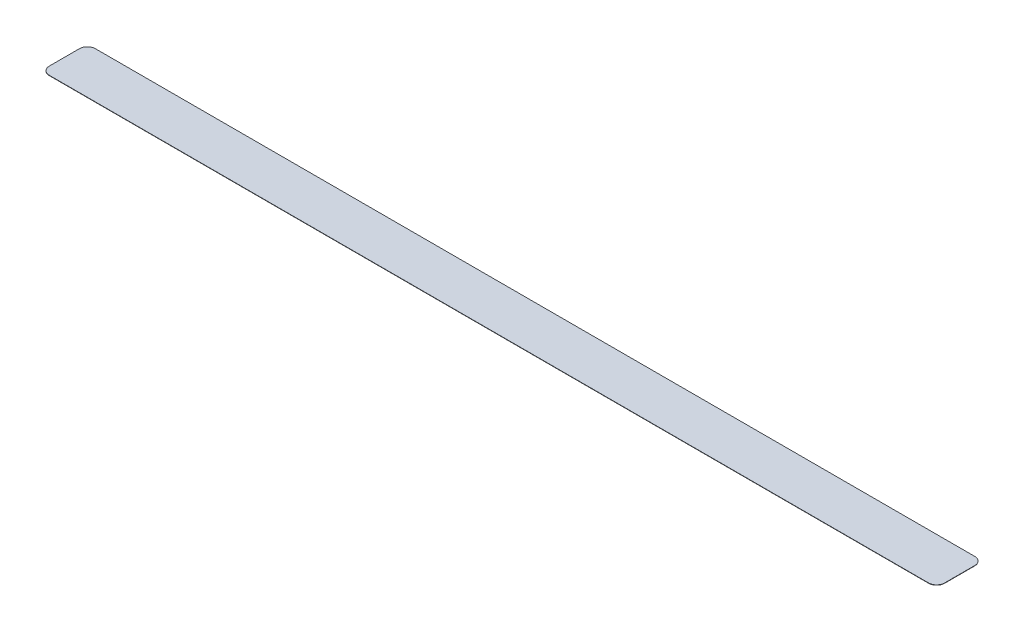
ISO-10303-21;
HEADER;
FILE_DESCRIPTION(('STEP AP214'),'2;1');
FILE_NAME('part.step','',(''),(''),'','','');
FILE_SCHEMA(('AUTOMOTIVE_DESIGN { 1 0 10303 214 1 1 1 1 }'));
ENDSEC;
DATA;
#1=APPLICATION_CONTEXT('core data for automotive mechanical design processes');
#2=APPLICATION_PROTOCOL_DEFINITION('international standard','automotive_design',2000,#1);
#3=PRODUCT_CONTEXT('',#1,'mechanical');
#4=PRODUCT('Part','Part','',(#3));
#5=PRODUCT_RELATED_PRODUCT_CATEGORY('part','',(#4));
#6=PRODUCT_DEFINITION_FORMATION('','',#4);
#7=PRODUCT_DEFINITION_CONTEXT('part definition',#1,'design');
#8=PRODUCT_DEFINITION('design','',#6,#7);
#9=PRODUCT_DEFINITION_SHAPE('','',#8);
#10=(LENGTH_UNIT() NAMED_UNIT(*) SI_UNIT(.MILLI.,.METRE.));
#11=(NAMED_UNIT(*) PLANE_ANGLE_UNIT() SI_UNIT($,.RADIAN.));
#12=(NAMED_UNIT(*) SI_UNIT($,.STERADIAN.) SOLID_ANGLE_UNIT());
#13=UNCERTAINTY_MEASURE_WITH_UNIT(LENGTH_MEASURE(1.E-05),#10,'distance_accuracy_value','');
#14=(GEOMETRIC_REPRESENTATION_CONTEXT(3) GLOBAL_UNCERTAINTY_ASSIGNED_CONTEXT((#13)) GLOBAL_UNIT_ASSIGNED_CONTEXT((#10,
#11,#12)) REPRESENTATION_CONTEXT('',''));
#15=CARTESIAN_POINT('',(0.,0.,0.));
#16=DIRECTION('',(0.,0.,1.));
#17=DIRECTION('',(1.,0.,0.));
#18=AXIS2_PLACEMENT_3D('',#15,#16,#17);
#19=CARTESIAN_POINT('',(-138.375,0.1,-4.74999999999988));
#20=DIRECTION('',(0.,-1.,0.));
#21=DIRECTION('',(0.,0.,-1.));
#22=AXIS2_PLACEMENT_3D('',#19,#20,#21);
#23=CYLINDRICAL_SURFACE('',#22,2.5);
#24=CARTESIAN_POINT('',(-138.375,0.,-4.74999999999988));
#25=DIRECTION('',(0.,1.,0.));
#26=DIRECTION('',(0.,0.,1.));
#27=AXIS2_PLACEMENT_3D('',#24,#25,#26);
#28=CIRCLE('',#27,2.5);
#29=CARTESIAN_POINT('',(-138.375,0.,-7.24999999999988));
#30=VERTEX_POINT('',#29);
#31=CARTESIAN_POINT('',(-140.875,0.,-4.74999999999986));
#32=VERTEX_POINT('',#31);
#33=EDGE_CURVE('E142',#30,#32,#28,.T.);
#34=ORIENTED_EDGE('',*,*,#33,.T.);
#35=DIRECTION('',(0.,-1.,0.));
#36=VECTOR('',#35,1.);
#37=CARTESIAN_POINT('',(-140.875,0.1,-4.74999999999986));
#38=LINE('',#37,#36);
#39=CARTESIAN_POINT('',(-140.875,0.1,-4.74999999999986));
#40=VERTEX_POINT('',#39);
#41=EDGE_CURVE('E11',#40,#32,#38,.T.);
#42=ORIENTED_EDGE('',*,*,#41,.F.);
#43=CARTESIAN_POINT('',(-138.375,0.1,-4.74999999999988));
#44=DIRECTION('',(0.,1.,0.));
#45=DIRECTION('',(0.,0.,1.));
#46=AXIS2_PLACEMENT_3D('',#43,#44,#45);
#47=CIRCLE('',#46,2.5);
#48=CARTESIAN_POINT('',(-138.375,0.1,-7.24999999999988));
#49=VERTEX_POINT('',#48);
#50=EDGE_CURVE('E164',#49,#40,#47,.T.);
#51=ORIENTED_EDGE('',*,*,#50,.F.);
#52=DIRECTION('',(0.,-1.,0.));
#53=VECTOR('',#52,1.);
#54=CARTESIAN_POINT('',(-138.375,0.1,-7.24999999999988));
#55=LINE('',#54,#53);
#56=EDGE_CURVE('E138',#49,#30,#55,.T.);
#57=ORIENTED_EDGE('',*,*,#56,.T.);
#58=EDGE_LOOP('',(#34,#42,#51,#57));
#59=FACE_BOUND('',#58,.T.);
#60=ADVANCED_FACE('F41',(#59),#23,.T.);
#61=CARTESIAN_POINT('',(-140.875,0.1,-4.74999999999986));
#62=DIRECTION('',(1.,0.,0.));
#63=DIRECTION('',(0.,0.,-1.));
#64=AXIS2_PLACEMENT_3D('',#61,#62,#63);
#65=PLANE('',#64);
#66=DIRECTION('',(0.,0.,1.));
#67=VECTOR('',#66,1.);
#68=CARTESIAN_POINT('',(-140.875,0.,-4.74999999999986));
#69=LINE('',#68,#67);
#70=CARTESIAN_POINT('',(-140.875,0.,4.7500000000008));
#71=VERTEX_POINT('',#70);
#72=EDGE_CURVE('E146',#32,#71,#69,.T.);
#73=ORIENTED_EDGE('',*,*,#72,.T.);
#74=DIRECTION('',(0.,-1.,0.));
#75=VECTOR('',#74,1.);
#76=CARTESIAN_POINT('',(-140.875,0.1,4.7500000000008));
#77=LINE('',#76,#75);
#78=CARTESIAN_POINT('',(-140.875,0.1,4.7500000000008));
#79=VERTEX_POINT('',#78);
#80=EDGE_CURVE('E50',#79,#71,#77,.T.);
#81=ORIENTED_EDGE('',*,*,#80,.F.);
#82=DIRECTION('',(0.,0.,1.));
#83=VECTOR('',#82,1.);
#84=CARTESIAN_POINT('',(-140.875,0.1,-4.74999999999986));
#85=LINE('',#84,#83);
#86=EDGE_CURVE('E101',#40,#79,#85,.T.);
#87=ORIENTED_EDGE('',*,*,#86,.F.);
#88=ORIENTED_EDGE('',*,*,#41,.T.);
#89=EDGE_LOOP('',(#73,#81,#87,#88));
#90=FACE_BOUND('',#89,.T.);
#91=ADVANCED_FACE('F210',(#90),#65,.F.);
#92=CARTESIAN_POINT('',(-138.375,0.1,4.75000000000082));
#93=DIRECTION('',(0.,-1.,0.));
#94=DIRECTION('',(0.,0.,-1.));
#95=AXIS2_PLACEMENT_3D('',#92,#93,#94);
#96=CYLINDRICAL_SURFACE('',#95,2.5);
#97=CARTESIAN_POINT('',(-138.375,0.,4.75000000000082));
#98=DIRECTION('',(0.,1.,0.));
#99=DIRECTION('',(0.,0.,1.));
#100=AXIS2_PLACEMENT_3D('',#97,#98,#99);
#101=CIRCLE('',#100,2.5);
#102=CARTESIAN_POINT('',(-138.375,0.,7.25000000000082));
#103=VERTEX_POINT('',#102);
#104=EDGE_CURVE('E149',#71,#103,#101,.T.);
#105=ORIENTED_EDGE('',*,*,#104,.T.);
#106=DIRECTION('',(0.,-1.,0.));
#107=VECTOR('',#106,1.);
#108=CARTESIAN_POINT('',(-138.375,0.1,7.25000000000082));
#109=LINE('',#108,#107);
#110=CARTESIAN_POINT('',(-138.375,0.1,7.25000000000082));
#111=VERTEX_POINT('',#110);
#112=EDGE_CURVE('E175',#111,#103,#109,.T.);
#113=ORIENTED_EDGE('',*,*,#112,.F.);
#114=CARTESIAN_POINT('',(-138.375,0.1,4.75000000000082));
#115=DIRECTION('',(0.,1.,0.));
#116=DIRECTION('',(0.,0.,1.));
#117=AXIS2_PLACEMENT_3D('',#114,#115,#116);
#118=CIRCLE('',#117,2.5);
#119=EDGE_CURVE('E185',#79,#111,#118,.T.);
#120=ORIENTED_EDGE('',*,*,#119,.F.);
#121=ORIENTED_EDGE('',*,*,#80,.T.);
#122=EDGE_LOOP('',(#105,#113,#120,#121));
#123=FACE_BOUND('',#122,.T.);
#124=ADVANCED_FACE('F183',(#123),#96,.T.);
#125=CARTESIAN_POINT('',(-138.375,0.1,7.25000000000082));
#126=DIRECTION('',(0.,0.,-1.));
#127=DIRECTION('',(-1.,0.,0.));
#128=AXIS2_PLACEMENT_3D('',#125,#126,#127);
#129=PLANE('',#128);
#130=DIRECTION('',(1.,0.,0.));
#131=VECTOR('',#130,1.);
#132=CARTESIAN_POINT('',(-138.375,0.,7.25000000000082));
#133=LINE('',#132,#131);
#134=CARTESIAN_POINT('',(138.375,0.,7.25000000000082));
#135=VERTEX_POINT('',#134);
#136=EDGE_CURVE('E152',#103,#135,#133,.T.);
#137=ORIENTED_EDGE('',*,*,#136,.T.);
#138=DIRECTION('',(0.,-1.,0.));
#139=VECTOR('',#138,1.);
#140=CARTESIAN_POINT('',(138.375,0.1,7.25000000000082));
#141=LINE('',#140,#139);
#142=CARTESIAN_POINT('',(138.375,0.1,7.25000000000082));
#143=VERTEX_POINT('',#142);
#144=EDGE_CURVE('E171',#143,#135,#141,.T.);
#145=ORIENTED_EDGE('',*,*,#144,.F.);
#146=DIRECTION('',(1.,0.,0.));
#147=VECTOR('',#146,1.);
#148=CARTESIAN_POINT('',(-138.375,0.1,7.25000000000082));
#149=LINE('',#148,#147);
#150=EDGE_CURVE('E198',#111,#143,#149,.T.);
#151=ORIENTED_EDGE('',*,*,#150,.F.);
#152=ORIENTED_EDGE('',*,*,#112,.T.);
#153=EDGE_LOOP('',(#137,#145,#151,#152));
#154=FACE_BOUND('',#153,.T.);
#155=ADVANCED_FACE('F193',(#154),#129,.F.);
#156=CARTESIAN_POINT('',(138.375,0.1,4.75000000000082));
#157=DIRECTION('',(0.,-1.,0.));
#158=DIRECTION('',(0.,0.,-1.));
#159=AXIS2_PLACEMENT_3D('',#156,#157,#158);
#160=CYLINDRICAL_SURFACE('',#159,2.5);
#161=CARTESIAN_POINT('',(138.375,0.,4.75000000000082));
#162=DIRECTION('',(0.,1.,0.));
#163=DIRECTION('',(0.,0.,1.));
#164=AXIS2_PLACEMENT_3D('',#161,#162,#163);
#165=CIRCLE('',#164,2.5);
#166=CARTESIAN_POINT('',(140.875,0.,4.7500000000008));
#167=VERTEX_POINT('',#166);
#168=EDGE_CURVE('E155',#135,#167,#165,.T.);
#169=ORIENTED_EDGE('',*,*,#168,.T.);
#170=DIRECTION('',(0.,-1.,0.));
#171=VECTOR('',#170,1.);
#172=CARTESIAN_POINT('',(140.875,0.1,4.7500000000008));
#173=LINE('',#172,#171);
#174=CARTESIAN_POINT('',(140.875,0.1,4.7500000000008));
#175=VERTEX_POINT('',#174);
#176=EDGE_CURVE('E131',#175,#167,#173,.T.);
#177=ORIENTED_EDGE('',*,*,#176,.F.);
#178=CARTESIAN_POINT('',(138.375,0.1,4.75000000000082));
#179=DIRECTION('',(0.,1.,0.));
#180=DIRECTION('',(0.,0.,1.));
#181=AXIS2_PLACEMENT_3D('',#178,#179,#180);
#182=CIRCLE('',#181,2.5);
#183=EDGE_CURVE('E120',#143,#175,#182,.T.);
#184=ORIENTED_EDGE('',*,*,#183,.F.);
#185=ORIENTED_EDGE('',*,*,#144,.T.);
#186=EDGE_LOOP('',(#169,#177,#184,#185));
#187=FACE_BOUND('',#186,.T.);
#188=ADVANCED_FACE('F196',(#187),#160,.T.);
#189=CARTESIAN_POINT('',(140.875,0.1,-4.74999999999986));
#190=DIRECTION('',(-1.,0.,0.));
#191=DIRECTION('',(0.,0.,1.));
#192=AXIS2_PLACEMENT_3D('',#189,#190,#191);
#193=PLANE('',#192);
#194=DIRECTION('',(0.,0.,-1.));
#195=VECTOR('',#194,1.);
#196=CARTESIAN_POINT('',(140.875,0.,-4.74999999999986));
#197=LINE('',#196,#195);
#198=CARTESIAN_POINT('',(140.875,0.,-4.74999999999986));
#199=VERTEX_POINT('',#198);
#200=EDGE_CURVE('E129',#167,#199,#197,.T.);
#201=ORIENTED_EDGE('',*,*,#200,.T.);
#202=DIRECTION('',(0.,-1.,0.));
#203=VECTOR('',#202,1.);
#204=CARTESIAN_POINT('',(140.875,0.1,-4.74999999999986));
#205=LINE('',#204,#203);
#206=CARTESIAN_POINT('',(140.875,0.1,-4.74999999999986));
#207=VERTEX_POINT('',#206);
#208=EDGE_CURVE('E126',#207,#199,#205,.T.);
#209=ORIENTED_EDGE('',*,*,#208,.F.);
#210=DIRECTION('',(0.,0.,-1.));
#211=VECTOR('',#210,1.);
#212=CARTESIAN_POINT('',(140.875,0.1,-4.74999999999986));
#213=LINE('',#212,#211);
#214=EDGE_CURVE('E114',#175,#207,#213,.T.);
#215=ORIENTED_EDGE('',*,*,#214,.F.);
#216=ORIENTED_EDGE('',*,*,#176,.T.);
#217=EDGE_LOOP('',(#201,#209,#215,#216));
#218=FACE_BOUND('',#217,.T.);
#219=ADVANCED_FACE('F127',(#218),#193,.F.);
#220=CARTESIAN_POINT('',(138.375,0.1,-4.74999999999988));
#221=DIRECTION('',(0.,-1.,0.));
#222=DIRECTION('',(0.,0.,-1.));
#223=AXIS2_PLACEMENT_3D('',#220,#221,#222);
#224=CYLINDRICAL_SURFACE('',#223,2.5);
#225=CARTESIAN_POINT('',(138.375,0.,-4.74999999999988));
#226=DIRECTION('',(0.,1.,0.));
#227=DIRECTION('',(0.,0.,-1.));
#228=AXIS2_PLACEMENT_3D('',#225,#226,#227);
#229=CIRCLE('',#228,2.5);
#230=CARTESIAN_POINT('',(138.375,0.,-7.24999999999988));
#231=VERTEX_POINT('',#230);
#232=EDGE_CURVE('E87',#199,#231,#229,.T.);
#233=ORIENTED_EDGE('',*,*,#232,.T.);
#234=DIRECTION('',(0.,-1.,0.));
#235=VECTOR('',#234,1.);
#236=CARTESIAN_POINT('',(138.375,0.1,-7.24999999999988));
#237=LINE('',#236,#235);
#238=CARTESIAN_POINT('',(138.375,0.1,-7.24999999999988));
#239=VERTEX_POINT('',#238);
#240=EDGE_CURVE('E132',#239,#231,#237,.T.);
#241=ORIENTED_EDGE('',*,*,#240,.F.);
#242=CARTESIAN_POINT('',(138.375,0.1,-4.74999999999988));
#243=DIRECTION('',(0.,1.,0.));
#244=DIRECTION('',(0.,0.,-1.));
#245=AXIS2_PLACEMENT_3D('',#242,#243,#244);
#246=CIRCLE('',#245,2.5);
#247=EDGE_CURVE('E118',#207,#239,#246,.T.);
#248=ORIENTED_EDGE('',*,*,#247,.F.);
#249=ORIENTED_EDGE('',*,*,#208,.T.);
#250=EDGE_LOOP('',(#233,#241,#248,#249));
#251=FACE_BOUND('',#250,.T.);
#252=ADVANCED_FACE('F134',(#251),#224,.T.);
#253=CARTESIAN_POINT('',(-138.375,0.1,-7.24999999999988));
#254=DIRECTION('',(0.,0.,1.));
#255=DIRECTION('',(1.,0.,0.));
#256=AXIS2_PLACEMENT_3D('',#253,#254,#255);
#257=PLANE('',#256);
#258=DIRECTION('',(-1.,0.,0.));
#259=VECTOR('',#258,1.);
#260=CARTESIAN_POINT('',(-138.375,0.,-7.24999999999988));
#261=LINE('',#260,#259);
#262=EDGE_CURVE('E93',#231,#30,#261,.T.);
#263=ORIENTED_EDGE('',*,*,#262,.T.);
#264=ORIENTED_EDGE('',*,*,#56,.F.);
#265=DIRECTION('',(-1.,0.,0.));
#266=VECTOR('',#265,1.);
#267=CARTESIAN_POINT('',(-138.375,0.1,-7.24999999999988));
#268=LINE('',#267,#266);
#269=EDGE_CURVE('E58',#239,#49,#268,.T.);
#270=ORIENTED_EDGE('',*,*,#269,.F.);
#271=ORIENTED_EDGE('',*,*,#240,.T.);
#272=EDGE_LOOP('',(#263,#264,#270,#271));
#273=FACE_BOUND('',#272,.T.);
#274=ADVANCED_FACE('F226',(#273),#257,.F.);
#275=CARTESIAN_POINT('',(-138.375,0.1,-4.74999999999988));
#276=DIRECTION('',(0.,1.,0.));
#277=DIRECTION('',(0.,0.,1.));
#278=AXIS2_PLACEMENT_3D('',#275,#276,#277);
#279=PLANE('',#278);
#280=ORIENTED_EDGE('',*,*,#50,.T.);
#281=ORIENTED_EDGE('',*,*,#86,.T.);
#282=ORIENTED_EDGE('',*,*,#119,.T.);
#283=ORIENTED_EDGE('',*,*,#150,.T.);
#284=ORIENTED_EDGE('',*,*,#183,.T.);
#285=ORIENTED_EDGE('',*,*,#214,.T.);
#286=ORIENTED_EDGE('',*,*,#247,.T.);
#287=ORIENTED_EDGE('',*,*,#269,.T.);
#288=EDGE_LOOP('',(#280,#281,#282,#283,#284,#285,#286,#287));
#289=FACE_BOUND('',#288,.T.);
#290=ADVANCED_FACE('F116',(#289),#279,.T.);
#291=CARTESIAN_POINT('',(-138.375,0.,-4.74999999999988));
#292=DIRECTION('',(0.,1.,0.));
#293=DIRECTION('',(0.,0.,1.));
#294=AXIS2_PLACEMENT_3D('',#291,#292,#293);
#295=PLANE('',#294);
#296=ORIENTED_EDGE('',*,*,#33,.F.);
#297=ORIENTED_EDGE('',*,*,#262,.F.);
#298=ORIENTED_EDGE('',*,*,#232,.F.);
#299=ORIENTED_EDGE('',*,*,#200,.F.);
#300=ORIENTED_EDGE('',*,*,#168,.F.);
#301=ORIENTED_EDGE('',*,*,#136,.F.);
#302=ORIENTED_EDGE('',*,*,#104,.F.);
#303=ORIENTED_EDGE('',*,*,#72,.F.);
#304=EDGE_LOOP('',(#296,#297,#298,#299,#300,#301,#302,#303));
#305=FACE_BOUND('',#304,.T.);
#306=ADVANCED_FACE('F189',(#305),#295,.F.);
#307=CLOSED_SHELL('',(#60,#91,#124,#155,#188,#219,#252,#274,#290,#306));
#308=MANIFOLD_SOLID_BREP('B2',#307);
#309=ADVANCED_BREP_SHAPE_REPRESENTATION('',(#18,#308),#14);
#310=SHAPE_DEFINITION_REPRESENTATION(#9,#309);
ENDSEC;
END-ISO-10303-21;
